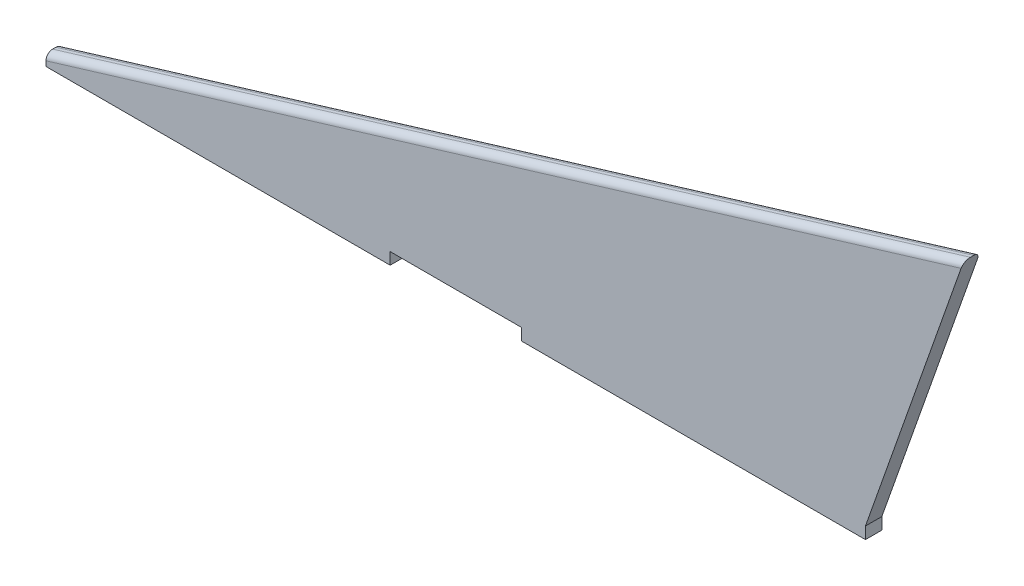
ISO-10303-21;
HEADER;
FILE_DESCRIPTION(('STEP AP214'),'2;1');
FILE_NAME('part.step','',(''),(''),'','','');
FILE_SCHEMA(('AUTOMOTIVE_DESIGN { 1 0 10303 214 1 1 1 1 }'));
ENDSEC;
DATA;
#1=APPLICATION_CONTEXT('core data for automotive mechanical design processes');
#2=APPLICATION_PROTOCOL_DEFINITION('international standard','automotive_design',2000,#1);
#3=PRODUCT_CONTEXT('',#1,'mechanical');
#4=PRODUCT('Part','Part','',(#3));
#5=PRODUCT_RELATED_PRODUCT_CATEGORY('part','',(#4));
#6=PRODUCT_DEFINITION_FORMATION('','',#4);
#7=PRODUCT_DEFINITION_CONTEXT('part definition',#1,'design');
#8=PRODUCT_DEFINITION('design','',#6,#7);
#9=PRODUCT_DEFINITION_SHAPE('','',#8);
#10=(LENGTH_UNIT() NAMED_UNIT(*) SI_UNIT(.MILLI.,.METRE.));
#11=(NAMED_UNIT(*) PLANE_ANGLE_UNIT() SI_UNIT($,.RADIAN.));
#12=(NAMED_UNIT(*) SI_UNIT($,.STERADIAN.) SOLID_ANGLE_UNIT());
#13=UNCERTAINTY_MEASURE_WITH_UNIT(LENGTH_MEASURE(1.E-05),#10,'distance_accuracy_value','');
#14=(GEOMETRIC_REPRESENTATION_CONTEXT(3) GLOBAL_UNCERTAINTY_ASSIGNED_CONTEXT((#13)) GLOBAL_UNIT_ASSIGNED_CONTEXT((#10,
#11,#12)) REPRESENTATION_CONTEXT('',''));
#15=CARTESIAN_POINT('',(0.,0.,0.));
#16=DIRECTION('',(0.,0.,1.));
#17=DIRECTION('',(1.,0.,0.));
#18=AXIS2_PLACEMENT_3D('',#15,#16,#17);
#19=CARTESIAN_POINT('',(140.,42.5,2.5));
#20=DIRECTION('',(-0.942990333582889,0.332820117735138,0.));
#21=DIRECTION('',(-0.332820117735138,-0.942990333582889,0.));
#22=AXIS2_PLACEMENT_3D('',#19,#20,#21);
#23=PLANE('',#22);
#24=DIRECTION('',(0.332820117735138,0.942990333582889,0.));
#25=VECTOR('',#24,1.);
#26=CARTESIAN_POINT('',(140.,42.5,0.));
#27=LINE('',#26,#25);
#28=CARTESIAN_POINT('',(125.,0.,0.));
#29=VERTEX_POINT('',#28);
#30=CARTESIAN_POINT('',(139.586892944328,41.329530008928,0.));
#31=VERTEX_POINT('',#30);
#32=EDGE_CURVE('E156',#29,#31,#27,.T.);
#33=ORIENTED_EDGE('',*,*,#32,.T.);
#34=CARTESIAN_POINT('',(139.586892944328,41.329530008928,1.));
#35=DIRECTION('',(-0.942990333582889,0.332820117735138,0.));
#36=DIRECTION('',(-0.332820117735138,-0.942990333582889,0.));
#37=AXIS2_PLACEMENT_3D('',#34,#35,#36);
#38=ELLIPSE('',#37,1.24123222623584,1.);
#39=CARTESIAN_POINT('',(140.,42.5,1.));
#40=VERTEX_POINT('',#39);
#41=EDGE_CURVE('E41',#31,#40,#38,.F.);
#42=ORIENTED_EDGE('',*,*,#41,.T.);
#43=DIRECTION('',(0.,0.,-1.));
#44=VECTOR('',#43,1.);
#45=CARTESIAN_POINT('',(140.,42.5,2.5));
#46=LINE('',#45,#44);
#47=CARTESIAN_POINT('',(140.,42.5,1.5));
#48=VERTEX_POINT('',#47);
#49=EDGE_CURVE('E187',#48,#40,#46,.T.);
#50=ORIENTED_EDGE('',*,*,#49,.F.);
#51=CARTESIAN_POINT('',(139.586892944328,41.329530008928,1.5));
#52=DIRECTION('',(-0.942990333582889,0.332820117735138,0.));
#53=DIRECTION('',(0.332820117735138,0.942990333582889,0.));
#54=AXIS2_PLACEMENT_3D('',#51,#52,#53);
#55=ELLIPSE('',#54,1.24123222623584,1.);
#56=CARTESIAN_POINT('',(139.586892944328,41.329530008928,2.5));
#57=VERTEX_POINT('',#56);
#58=EDGE_CURVE('E48',#48,#57,#55,.F.);
#59=ORIENTED_EDGE('',*,*,#58,.T.);
#60=DIRECTION('',(0.332820117735138,0.942990333582889,0.));
#61=VECTOR('',#60,1.);
#62=CARTESIAN_POINT('',(140.,42.5,2.5));
#63=LINE('',#62,#61);
#64=CARTESIAN_POINT('',(125.,0.,2.5));
#65=VERTEX_POINT('',#64);
#66=EDGE_CURVE('E127',#65,#57,#63,.T.);
#67=ORIENTED_EDGE('',*,*,#66,.F.);
#68=DIRECTION('',(0.,0.,-1.));
#69=VECTOR('',#68,1.);
#70=CARTESIAN_POINT('',(125.,0.,2.5));
#71=LINE('',#70,#69);
#72=EDGE_CURVE('E155',#65,#29,#71,.T.);
#73=ORIENTED_EDGE('',*,*,#72,.T.);
#74=EDGE_LOOP('',(#33,#42,#50,#59,#67,#73));
#75=FACE_BOUND('',#74,.T.);
#76=ADVANCED_FACE('F33',(#75),#23,.F.);
#77=CARTESIAN_POINT('',(0.,0.,2.5));
#78=DIRECTION('',(0.290481603623699,-0.956880576642772,0.));
#79=DIRECTION('',(0.956880576642772,0.290481603623699,0.));
#80=AXIS2_PLACEMENT_3D('',#77,#78,#79);
#81=PLANE('',#80);
#82=ORIENTED_EDGE('',*,*,#49,.T.);
#83=DIRECTION('',(-0.956880576642772,-0.290481603623699,0.));
#84=VECTOR('',#83,1.);
#85=CARTESIAN_POINT('',(0.,0.,1.));
#86=LINE('',#85,#84);
#87=CARTESIAN_POINT('',(0.,0.,1.));
#88=VERTEX_POINT('',#87);
#89=EDGE_CURVE('E192',#40,#88,#86,.T.);
#90=ORIENTED_EDGE('',*,*,#89,.T.);
#91=DIRECTION('',(0.,0.,-1.));
#92=VECTOR('',#91,1.);
#93=CARTESIAN_POINT('',(0.,0.,2.5));
#94=LINE('',#93,#92);
#95=CARTESIAN_POINT('',(0.,0.,1.5));
#96=VERTEX_POINT('',#95);
#97=EDGE_CURVE('E136',#96,#88,#94,.T.);
#98=ORIENTED_EDGE('',*,*,#97,.F.);
#99=DIRECTION('',(-0.956880576642772,-0.290481603623699,0.));
#100=VECTOR('',#99,1.);
#101=CARTESIAN_POINT('',(140.,42.5,1.5));
#102=LINE('',#101,#100);
#103=EDGE_CURVE('E190',#96,#48,#102,.F.);
#104=ORIENTED_EDGE('',*,*,#103,.T.);
#105=EDGE_LOOP('',(#82,#90,#98,#104));
#106=FACE_BOUND('',#105,.T.);
#107=ADVANCED_FACE('F204',(#106),#81,.F.);
#108=CARTESIAN_POINT('',(0.,0.,2.5));
#109=DIRECTION('',(1.,0.,0.));
#110=DIRECTION('',(0.,1.,0.));
#111=AXIS2_PLACEMENT_3D('',#108,#109,#110);
#112=PLANE('',#111);
#113=ORIENTED_EDGE('',*,*,#97,.T.);
#114=CARTESIAN_POINT('',(0.,-1.04506249202854,1.));
#115=DIRECTION('',(1.,0.,0.));
#116=DIRECTION('',(0.,-1.,0.));
#117=AXIS2_PLACEMENT_3D('',#114,#115,#116);
#118=ELLIPSE('',#117,1.04506249202854,1.);
#119=CARTESIAN_POINT('',(0.,-1.04506249202855,0.));
#120=VERTEX_POINT('',#119);
#121=EDGE_CURVE('E197',#88,#120,#118,.F.);
#122=ORIENTED_EDGE('',*,*,#121,.T.);
#123=DIRECTION('',(0.,-1.,0.));
#124=VECTOR('',#123,1.);
#125=CARTESIAN_POINT('',(0.,0.,0.));
#126=LINE('',#125,#124);
#127=CARTESIAN_POINT('',(0.,-1.8,0.));
#128=VERTEX_POINT('',#127);
#129=EDGE_CURVE('E133',#120,#128,#126,.T.);
#130=ORIENTED_EDGE('',*,*,#129,.T.);
#131=DIRECTION('',(0.,0.,-1.));
#132=VECTOR('',#131,1.);
#133=CARTESIAN_POINT('',(0.,-1.8,2.5));
#134=LINE('',#133,#132);
#135=CARTESIAN_POINT('',(0.,-1.8,2.5));
#136=VERTEX_POINT('',#135);
#137=EDGE_CURVE('E130',#136,#128,#134,.T.);
#138=ORIENTED_EDGE('',*,*,#137,.F.);
#139=DIRECTION('',(0.,-1.,0.));
#140=VECTOR('',#139,1.);
#141=CARTESIAN_POINT('',(0.,0.,2.5));
#142=LINE('',#141,#140);
#143=CARTESIAN_POINT('',(0.,-1.04506249202854,2.5));
#144=VERTEX_POINT('',#143);
#145=EDGE_CURVE('E119',#144,#136,#142,.T.);
#146=ORIENTED_EDGE('',*,*,#145,.F.);
#147=CARTESIAN_POINT('',(0.,-1.04506249202854,1.5));
#148=DIRECTION('',(1.,0.,0.));
#149=DIRECTION('',(0.,1.,0.));
#150=AXIS2_PLACEMENT_3D('',#147,#148,#149);
#151=ELLIPSE('',#150,1.04506249202854,1.);
#152=EDGE_CURVE('E195',#144,#96,#151,.F.);
#153=ORIENTED_EDGE('',*,*,#152,.T.);
#154=EDGE_LOOP('',(#113,#122,#130,#138,#146,#153));
#155=FACE_BOUND('',#154,.T.);
#156=ADVANCED_FACE('F132',(#155),#112,.F.);
#157=CARTESIAN_POINT('',(0.,-1.8,2.5));
#158=DIRECTION('',(0.,1.,0.));
#159=DIRECTION('',(0.,0.,1.));
#160=AXIS2_PLACEMENT_3D('',#157,#158,#159);
#161=PLANE('',#160);
#162=DIRECTION('',(1.,0.,0.));
#163=VECTOR('',#162,1.);
#164=CARTESIAN_POINT('',(0.,-1.8,0.));
#165=LINE('',#164,#163);
#166=CARTESIAN_POINT('',(52.5,-1.8,0.));
#167=VERTEX_POINT('',#166);
#168=EDGE_CURVE('E159',#128,#167,#165,.T.);
#169=ORIENTED_EDGE('',*,*,#168,.T.);
#170=DIRECTION('',(0.,0.,-1.));
#171=VECTOR('',#170,1.);
#172=CARTESIAN_POINT('',(52.5,-1.8,2.5));
#173=LINE('',#172,#171);
#174=CARTESIAN_POINT('',(52.5,-1.8,2.5));
#175=VERTEX_POINT('',#174);
#176=EDGE_CURVE('E137',#175,#167,#173,.T.);
#177=ORIENTED_EDGE('',*,*,#176,.F.);
#178=DIRECTION('',(1.,0.,0.));
#179=VECTOR('',#178,1.);
#180=CARTESIAN_POINT('',(0.,-1.8,2.5));
#181=LINE('',#180,#179);
#182=EDGE_CURVE('E123',#136,#175,#181,.T.);
#183=ORIENTED_EDGE('',*,*,#182,.F.);
#184=ORIENTED_EDGE('',*,*,#137,.T.);
#185=EDGE_LOOP('',(#169,#177,#183,#184));
#186=FACE_BOUND('',#185,.T.);
#187=ADVANCED_FACE('F139',(#186),#161,.F.);
#188=CARTESIAN_POINT('',(52.5,0.,2.5));
#189=DIRECTION('',(-1.,0.,0.));
#190=DIRECTION('',(0.,0.,1.));
#191=AXIS2_PLACEMENT_3D('',#188,#189,#190);
#192=PLANE('',#191);
#193=DIRECTION('',(0.,1.,0.));
#194=VECTOR('',#193,1.);
#195=CARTESIAN_POINT('',(52.5,0.,0.));
#196=LINE('',#195,#194);
#197=CARTESIAN_POINT('',(52.5,0.,0.));
#198=VERTEX_POINT('',#197);
#199=EDGE_CURVE('E161',#167,#198,#196,.T.);
#200=ORIENTED_EDGE('',*,*,#199,.T.);
#201=DIRECTION('',(0.,0.,-1.));
#202=VECTOR('',#201,1.);
#203=CARTESIAN_POINT('',(52.5,0.,2.5));
#204=LINE('',#203,#202);
#205=CARTESIAN_POINT('',(52.5,0.,2.5));
#206=VERTEX_POINT('',#205);
#207=EDGE_CURVE('E182',#206,#198,#204,.T.);
#208=ORIENTED_EDGE('',*,*,#207,.F.);
#209=DIRECTION('',(0.,1.,0.));
#210=VECTOR('',#209,1.);
#211=CARTESIAN_POINT('',(52.5,0.,2.5));
#212=LINE('',#211,#210);
#213=EDGE_CURVE('E142',#175,#206,#212,.T.);
#214=ORIENTED_EDGE('',*,*,#213,.F.);
#215=ORIENTED_EDGE('',*,*,#176,.T.);
#216=EDGE_LOOP('',(#200,#208,#214,#215));
#217=FACE_BOUND('',#216,.T.);
#218=ADVANCED_FACE('F212',(#217),#192,.F.);
#219=CARTESIAN_POINT('',(72.5,0.,2.5));
#220=DIRECTION('',(0.,1.,0.));
#221=DIRECTION('',(-1.,0.,0.));
#222=AXIS2_PLACEMENT_3D('',#219,#220,#221);
#223=PLANE('',#222);
#224=DIRECTION('',(1.,0.,0.));
#225=VECTOR('',#224,1.);
#226=CARTESIAN_POINT('',(72.5,0.,0.));
#227=LINE('',#226,#225);
#228=CARTESIAN_POINT('',(72.5,0.,0.));
#229=VERTEX_POINT('',#228);
#230=EDGE_CURVE('E163',#198,#229,#227,.T.);
#231=ORIENTED_EDGE('',*,*,#230,.T.);
#232=DIRECTION('',(0.,0.,-1.));
#233=VECTOR('',#232,1.);
#234=CARTESIAN_POINT('',(72.5,0.,2.5));
#235=LINE('',#234,#233);
#236=CARTESIAN_POINT('',(72.5,0.,2.5));
#237=VERTEX_POINT('',#236);
#238=EDGE_CURVE('E179',#237,#229,#235,.T.);
#239=ORIENTED_EDGE('',*,*,#238,.F.);
#240=DIRECTION('',(1.,0.,0.));
#241=VECTOR('',#240,1.);
#242=CARTESIAN_POINT('',(72.5,0.,2.5));
#243=LINE('',#242,#241);
#244=EDGE_CURVE('E144',#206,#237,#243,.T.);
#245=ORIENTED_EDGE('',*,*,#244,.F.);
#246=ORIENTED_EDGE('',*,*,#207,.T.);
#247=EDGE_LOOP('',(#231,#239,#245,#246));
#248=FACE_BOUND('',#247,.T.);
#249=ADVANCED_FACE('F219',(#248),#223,.F.);
#250=CARTESIAN_POINT('',(72.5,0.,2.5));
#251=DIRECTION('',(1.,0.,0.));
#252=DIRECTION('',(0.,0.,-1.));
#253=AXIS2_PLACEMENT_3D('',#250,#251,#252);
#254=PLANE('',#253);
#255=DIRECTION('',(0.,-1.,0.));
#256=VECTOR('',#255,1.);
#257=CARTESIAN_POINT('',(72.5,0.,0.));
#258=LINE('',#257,#256);
#259=CARTESIAN_POINT('',(72.5,-1.8,0.));
#260=VERTEX_POINT('',#259);
#261=EDGE_CURVE('E165',#229,#260,#258,.T.);
#262=ORIENTED_EDGE('',*,*,#261,.T.);
#263=DIRECTION('',(0.,0.,-1.));
#264=VECTOR('',#263,1.);
#265=CARTESIAN_POINT('',(72.5,-1.8,2.5));
#266=LINE('',#265,#264);
#267=CARTESIAN_POINT('',(72.5,-1.8,2.5));
#268=VERTEX_POINT('',#267);
#269=EDGE_CURVE('E176',#268,#260,#266,.T.);
#270=ORIENTED_EDGE('',*,*,#269,.F.);
#271=DIRECTION('',(0.,-1.,0.));
#272=VECTOR('',#271,1.);
#273=CARTESIAN_POINT('',(72.5,0.,2.5));
#274=LINE('',#273,#272);
#275=EDGE_CURVE('E149',#237,#268,#274,.T.);
#276=ORIENTED_EDGE('',*,*,#275,.F.);
#277=ORIENTED_EDGE('',*,*,#238,.T.);
#278=EDGE_LOOP('',(#262,#270,#276,#277));
#279=FACE_BOUND('',#278,.T.);
#280=ADVANCED_FACE('F222',(#279),#254,.F.);
#281=CARTESIAN_POINT('',(72.5,-1.8,2.5));
#282=DIRECTION('',(0.,1.,0.));
#283=DIRECTION('',(-1.,0.,0.));
#284=AXIS2_PLACEMENT_3D('',#281,#282,#283);
#285=PLANE('',#284);
#286=DIRECTION('',(1.,0.,0.));
#287=VECTOR('',#286,1.);
#288=CARTESIAN_POINT('',(72.5,-1.8,0.));
#289=LINE('',#288,#287);
#290=CARTESIAN_POINT('',(125.,-1.8,0.));
#291=VERTEX_POINT('',#290);
#292=EDGE_CURVE('E167',#260,#291,#289,.T.);
#293=ORIENTED_EDGE('',*,*,#292,.T.);
#294=DIRECTION('',(0.,0.,-1.));
#295=VECTOR('',#294,1.);
#296=CARTESIAN_POINT('',(125.,-1.8,2.5));
#297=LINE('',#296,#295);
#298=CARTESIAN_POINT('',(125.,-1.8,2.5));
#299=VERTEX_POINT('',#298);
#300=EDGE_CURVE('E173',#299,#291,#297,.T.);
#301=ORIENTED_EDGE('',*,*,#300,.F.);
#302=DIRECTION('',(1.,0.,0.));
#303=VECTOR('',#302,1.);
#304=CARTESIAN_POINT('',(72.5,-1.8,2.5));
#305=LINE('',#304,#303);
#306=EDGE_CURVE('E151',#268,#299,#305,.T.);
#307=ORIENTED_EDGE('',*,*,#306,.F.);
#308=ORIENTED_EDGE('',*,*,#269,.T.);
#309=EDGE_LOOP('',(#293,#301,#307,#308));
#310=FACE_BOUND('',#309,.T.);
#311=ADVANCED_FACE('F227',(#310),#285,.F.);
#312=CARTESIAN_POINT('',(125.,0.,2.5));
#313=DIRECTION('',(-1.,0.,0.));
#314=DIRECTION('',(0.,-1.,0.));
#315=AXIS2_PLACEMENT_3D('',#312,#313,#314);
#316=PLANE('',#315);
#317=DIRECTION('',(0.,1.,0.));
#318=VECTOR('',#317,1.);
#319=CARTESIAN_POINT('',(125.,0.,0.));
#320=LINE('',#319,#318);
#321=EDGE_CURVE('E169',#291,#29,#320,.T.);
#322=ORIENTED_EDGE('',*,*,#321,.T.);
#323=ORIENTED_EDGE('',*,*,#72,.F.);
#324=DIRECTION('',(0.,1.,0.));
#325=VECTOR('',#324,1.);
#326=CARTESIAN_POINT('',(125.,0.,2.5));
#327=LINE('',#326,#325);
#328=EDGE_CURVE('E153',#299,#65,#327,.T.);
#329=ORIENTED_EDGE('',*,*,#328,.F.);
#330=ORIENTED_EDGE('',*,*,#300,.T.);
#331=EDGE_LOOP('',(#322,#323,#329,#330));
#332=FACE_BOUND('',#331,.T.);
#333=ADVANCED_FACE('F231',(#332),#316,.F.);
#334=CARTESIAN_POINT('',(0.,0.,2.5));
#335=DIRECTION('',(0.,0.,1.));
#336=DIRECTION('',(1.,0.,0.));
#337=AXIS2_PLACEMENT_3D('',#334,#335,#336);
#338=PLANE('',#337);
#339=ORIENTED_EDGE('',*,*,#66,.T.);
#340=DIRECTION('',(-0.956880576642772,-0.290481603623699,0.));
#341=VECTOR('',#340,1.);
#342=CARTESIAN_POINT('',(0.290481603623699,-0.956880576642772,2.5));
#343=LINE('',#342,#341);
#344=EDGE_CURVE('E11',#57,#144,#343,.T.);
#345=ORIENTED_EDGE('',*,*,#344,.T.);
#346=ORIENTED_EDGE('',*,*,#145,.T.);
#347=ORIENTED_EDGE('',*,*,#182,.T.);
#348=ORIENTED_EDGE('',*,*,#213,.T.);
#349=ORIENTED_EDGE('',*,*,#244,.T.);
#350=ORIENTED_EDGE('',*,*,#275,.T.);
#351=ORIENTED_EDGE('',*,*,#306,.T.);
#352=ORIENTED_EDGE('',*,*,#328,.T.);
#353=EDGE_LOOP('',(#339,#345,#346,#347,#348,#349,#350,#351,#352));
#354=FACE_BOUND('',#353,.T.);
#355=ADVANCED_FACE('F121',(#354),#338,.T.);
#356=CARTESIAN_POINT('',(0.,0.,0.));
#357=DIRECTION('',(0.,0.,1.));
#358=DIRECTION('',(1.,0.,0.));
#359=AXIS2_PLACEMENT_3D('',#356,#357,#358);
#360=PLANE('',#359);
#361=ORIENTED_EDGE('',*,*,#129,.F.);
#362=DIRECTION('',(-0.956880576642772,-0.290481603623699,0.));
#363=VECTOR('',#362,1.);
#364=CARTESIAN_POINT('',(0.290481603623699,-0.956880576642773,0.));
#365=LINE('',#364,#363);
#366=EDGE_CURVE('E56',#120,#31,#365,.F.);
#367=ORIENTED_EDGE('',*,*,#366,.T.);
#368=ORIENTED_EDGE('',*,*,#32,.F.);
#369=ORIENTED_EDGE('',*,*,#321,.F.);
#370=ORIENTED_EDGE('',*,*,#292,.F.);
#371=ORIENTED_EDGE('',*,*,#261,.F.);
#372=ORIENTED_EDGE('',*,*,#230,.F.);
#373=ORIENTED_EDGE('',*,*,#199,.F.);
#374=ORIENTED_EDGE('',*,*,#168,.F.);
#375=EDGE_LOOP('',(#361,#367,#368,#369,#370,#371,#372,#373,#374));
#376=FACE_BOUND('',#375,.T.);
#377=ADVANCED_FACE('F208',(#376),#360,.F.);
#378=CARTESIAN_POINT('',(0.290481603623699,-0.956880576642772,1.));
#379=DIRECTION('',(-0.956880576642772,-0.290481603623699,0.));
#380=DIRECTION('',(0.290481603623699,-0.956880576642772,0.));
#381=AXIS2_PLACEMENT_3D('',#378,#379,#380);
#382=CYLINDRICAL_SURFACE('',#381,1.);
#383=ORIENTED_EDGE('',*,*,#41,.F.);
#384=ORIENTED_EDGE('',*,*,#366,.F.);
#385=ORIENTED_EDGE('',*,*,#121,.F.);
#386=ORIENTED_EDGE('',*,*,#89,.F.);
#387=EDGE_LOOP('',(#383,#384,#385,#386));
#388=FACE_BOUND('',#387,.T.);
#389=ADVANCED_FACE('F207',(#388),#382,.T.);
#390=CARTESIAN_POINT('',(0.290481603623699,-0.956880576642772,1.5));
#391=DIRECTION('',(0.956880576642772,0.290481603623699,0.));
#392=DIRECTION('',(-0.290481603623699,0.956880576642772,0.));
#393=AXIS2_PLACEMENT_3D('',#390,#391,#392);
#394=CYLINDRICAL_SURFACE('',#393,1.);
#395=ORIENTED_EDGE('',*,*,#58,.F.);
#396=ORIENTED_EDGE('',*,*,#103,.F.);
#397=ORIENTED_EDGE('',*,*,#152,.F.);
#398=ORIENTED_EDGE('',*,*,#344,.F.);
#399=EDGE_LOOP('',(#395,#396,#397,#398));
#400=FACE_BOUND('',#399,.T.);
#401=ADVANCED_FACE('F35',(#400),#394,.T.);
#402=CLOSED_SHELL('',(#76,#107,#156,#187,#218,#249,#280,#311,#333,#355,#377,#389,#401));
#403=MANIFOLD_SOLID_BREP('B2',#402);
#404=ADVANCED_BREP_SHAPE_REPRESENTATION('',(#18,#403),#14);
#405=SHAPE_DEFINITION_REPRESENTATION(#9,#404);
ENDSEC;
END-ISO-10303-21;
